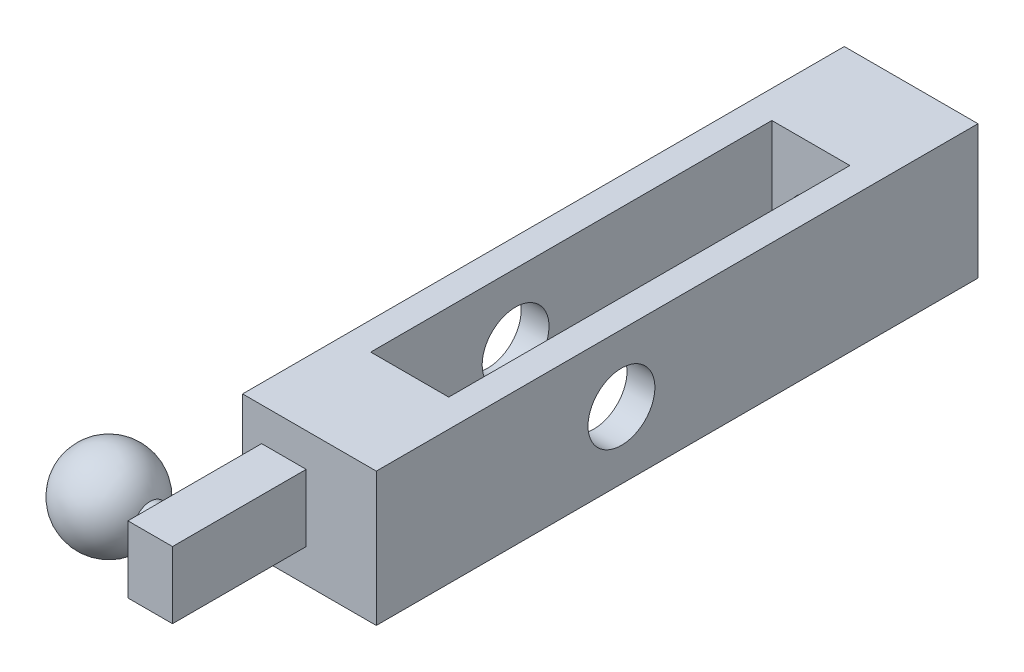
ISO-10303-21;
HEADER;
FILE_DESCRIPTION(('STEP AP214'),'2;1');
FILE_NAME('part.step','',(''),(''),'','','');
FILE_SCHEMA(('AUTOMOTIVE_DESIGN { 1 0 10303 214 1 1 1 1 }'));
ENDSEC;
DATA;
#1=APPLICATION_CONTEXT('core data for automotive mechanical design processes');
#2=APPLICATION_PROTOCOL_DEFINITION('international standard','automotive_design',2000,#1);
#3=PRODUCT_CONTEXT('',#1,'mechanical');
#4=PRODUCT('Part','Part','',(#3));
#5=PRODUCT_RELATED_PRODUCT_CATEGORY('part','',(#4));
#6=PRODUCT_DEFINITION_FORMATION('','',#4);
#7=PRODUCT_DEFINITION_CONTEXT('part definition',#1,'design');
#8=PRODUCT_DEFINITION('design','',#6,#7);
#9=PRODUCT_DEFINITION_SHAPE('','',#8);
#10=(LENGTH_UNIT() NAMED_UNIT(*) SI_UNIT(.MILLI.,.METRE.));
#11=(NAMED_UNIT(*) PLANE_ANGLE_UNIT() SI_UNIT($,.RADIAN.));
#12=(NAMED_UNIT(*) SI_UNIT($,.STERADIAN.) SOLID_ANGLE_UNIT());
#13=UNCERTAINTY_MEASURE_WITH_UNIT(LENGTH_MEASURE(1.E-05),#10,'distance_accuracy_value','');
#14=(GEOMETRIC_REPRESENTATION_CONTEXT(3) GLOBAL_UNCERTAINTY_ASSIGNED_CONTEXT((#13)) GLOBAL_UNIT_ASSIGNED_CONTEXT((#10,
#11,#12)) REPRESENTATION_CONTEXT('',''));
#15=CARTESIAN_POINT('',(0.,0.,0.));
#16=DIRECTION('',(0.,0.,1.));
#17=DIRECTION('',(1.,0.,0.));
#18=AXIS2_PLACEMENT_3D('',#15,#16,#17);
#19=CARTESIAN_POINT('',(3.,-3.,27.));
#20=DIRECTION('',(0.,1.,0.));
#21=DIRECTION('',(-1.,0.,0.));
#22=AXIS2_PLACEMENT_3D('',#19,#20,#21);
#23=PLANE('',#22);
#24=DIRECTION('',(1.,0.,0.));
#25=VECTOR('',#24,1.);
#26=CARTESIAN_POINT('',(3.,-3.,0.));
#27=LINE('',#26,#25);
#28=CARTESIAN_POINT('',(-3.,-3.,0.));
#29=VERTEX_POINT('',#28);
#30=CARTESIAN_POINT('',(3.,-3.,0.));
#31=VERTEX_POINT('',#30);
#32=EDGE_CURVE('E218',#29,#31,#27,.T.);
#33=ORIENTED_EDGE('',*,*,#32,.T.);
#34=DIRECTION('',(0.,0.,-1.));
#35=VECTOR('',#34,1.);
#36=CARTESIAN_POINT('',(3.,-3.,27.));
#37=LINE('',#36,#35);
#38=CARTESIAN_POINT('',(3.,-3.,27.));
#39=VERTEX_POINT('',#38);
#40=EDGE_CURVE('E228',#39,#31,#37,.T.);
#41=ORIENTED_EDGE('',*,*,#40,.F.);
#42=DIRECTION('',(1.,0.,0.));
#43=VECTOR('',#42,1.);
#44=CARTESIAN_POINT('',(3.,-3.,27.));
#45=LINE('',#44,#43);
#46=CARTESIAN_POINT('',(-3.,-3.,27.));
#47=VERTEX_POINT('',#46);
#48=EDGE_CURVE('E208',#47,#39,#45,.T.);
#49=ORIENTED_EDGE('',*,*,#48,.F.);
#50=DIRECTION('',(0.,0.,-1.));
#51=VECTOR('',#50,1.);
#52=CARTESIAN_POINT('',(-3.,-3.,27.));
#53=LINE('',#52,#51);
#54=EDGE_CURVE('E50',#47,#29,#53,.T.);
#55=ORIENTED_EDGE('',*,*,#54,.T.);
#56=EDGE_LOOP('',(#33,#41,#49,#55));
#57=FACE_BOUND('',#56,.T.);
#58=DIRECTION('',(1.,0.,0.));
#59=VECTOR('',#58,1.);
#60=CARTESIAN_POINT('',(3.,-3.,4.5));
#61=LINE('',#60,#59);
#62=CARTESIAN_POINT('',(-1.75,-3.,4.5));
#63=VERTEX_POINT('',#62);
#64=CARTESIAN_POINT('',(1.75,-3.,4.5));
#65=VERTEX_POINT('',#64);
#66=EDGE_CURVE('E135',#63,#65,#61,.T.);
#67=ORIENTED_EDGE('',*,*,#66,.F.);
#68=DIRECTION('',(0.,0.,-1.));
#69=VECTOR('',#68,1.);
#70=CARTESIAN_POINT('',(-1.75,-3.,27.));
#71=LINE('',#70,#69);
#72=CARTESIAN_POINT('',(-1.75,-3.,22.5));
#73=VERTEX_POINT('',#72);
#74=EDGE_CURVE('E138',#73,#63,#71,.T.);
#75=ORIENTED_EDGE('',*,*,#74,.F.);
#76=DIRECTION('',(-1.,0.,0.));
#77=VECTOR('',#76,1.);
#78=CARTESIAN_POINT('',(3.,-3.,22.5));
#79=LINE('',#78,#77);
#80=CARTESIAN_POINT('',(1.75,-3.,22.5));
#81=VERTEX_POINT('',#80);
#82=EDGE_CURVE('E167',#81,#73,#79,.T.);
#83=ORIENTED_EDGE('',*,*,#82,.F.);
#84=DIRECTION('',(0.,0.,1.));
#85=VECTOR('',#84,1.);
#86=CARTESIAN_POINT('',(1.75,-3.,27.));
#87=LINE('',#86,#85);
#88=EDGE_CURVE('E169',#65,#81,#87,.T.);
#89=ORIENTED_EDGE('',*,*,#88,.F.);
#90=EDGE_LOOP('',(#67,#75,#83,#89));
#91=FACE_BOUND('',#90,.T.);
#92=ADVANCED_FACE('F41',(#57,#91),#23,.F.);
#93=CARTESIAN_POINT('',(3.,3.,27.));
#94=DIRECTION('',(0.,-1.,0.));
#95=DIRECTION('',(1.,0.,0.));
#96=AXIS2_PLACEMENT_3D('',#93,#94,#95);
#97=PLANE('',#96);
#98=DIRECTION('',(-1.,0.,0.));
#99=VECTOR('',#98,1.);
#100=CARTESIAN_POINT('',(3.,3.,0.));
#101=LINE('',#100,#99);
#102=CARTESIAN_POINT('',(3.,3.,0.));
#103=VERTEX_POINT('',#102);
#104=CARTESIAN_POINT('',(-3.,3.,0.));
#105=VERTEX_POINT('',#104);
#106=EDGE_CURVE('E209',#103,#105,#101,.T.);
#107=ORIENTED_EDGE('',*,*,#106,.T.);
#108=DIRECTION('',(0.,0.,-1.));
#109=VECTOR('',#108,1.);
#110=CARTESIAN_POINT('',(-3.,3.,27.));
#111=LINE('',#110,#109);
#112=CARTESIAN_POINT('',(-3.,3.,27.));
#113=VERTEX_POINT('',#112);
#114=EDGE_CURVE('E215',#113,#105,#111,.T.);
#115=ORIENTED_EDGE('',*,*,#114,.F.);
#116=DIRECTION('',(-1.,0.,0.));
#117=VECTOR('',#116,1.);
#118=CARTESIAN_POINT('',(3.,3.,27.));
#119=LINE('',#118,#117);
#120=CARTESIAN_POINT('',(3.,3.,27.));
#121=VERTEX_POINT('',#120);
#122=EDGE_CURVE('E213',#121,#113,#119,.T.);
#123=ORIENTED_EDGE('',*,*,#122,.F.);
#124=DIRECTION('',(0.,0.,-1.));
#125=VECTOR('',#124,1.);
#126=CARTESIAN_POINT('',(3.,3.,27.));
#127=LINE('',#126,#125);
#128=EDGE_CURVE('E225',#121,#103,#127,.T.);
#129=ORIENTED_EDGE('',*,*,#128,.T.);
#130=EDGE_LOOP('',(#107,#115,#123,#129));
#131=FACE_BOUND('',#130,.T.);
#132=DIRECTION('',(1.,0.,0.));
#133=VECTOR('',#132,1.);
#134=CARTESIAN_POINT('',(-1.75,3.,4.5));
#135=LINE('',#134,#133);
#136=CARTESIAN_POINT('',(-1.75,3.,4.5));
#137=VERTEX_POINT('',#136);
#138=CARTESIAN_POINT('',(1.75,3.,4.5));
#139=VERTEX_POINT('',#138);
#140=EDGE_CURVE('E66',#137,#139,#135,.T.);
#141=ORIENTED_EDGE('',*,*,#140,.T.);
#142=DIRECTION('',(0.,0.,1.));
#143=VECTOR('',#142,1.);
#144=CARTESIAN_POINT('',(1.75,3.,4.5));
#145=LINE('',#144,#143);
#146=CARTESIAN_POINT('',(1.75,3.,22.5));
#147=VERTEX_POINT('',#146);
#148=EDGE_CURVE('E142',#139,#147,#145,.T.);
#149=ORIENTED_EDGE('',*,*,#148,.T.);
#150=DIRECTION('',(-1.,0.,0.));
#151=VECTOR('',#150,1.);
#152=CARTESIAN_POINT('',(-1.75,3.,22.5));
#153=LINE('',#152,#151);
#154=CARTESIAN_POINT('',(-1.75,3.,22.5));
#155=VERTEX_POINT('',#154);
#156=EDGE_CURVE('E148',#147,#155,#153,.T.);
#157=ORIENTED_EDGE('',*,*,#156,.T.);
#158=DIRECTION('',(0.,0.,-1.));
#159=VECTOR('',#158,1.);
#160=CARTESIAN_POINT('',(-1.75,3.,4.5));
#161=LINE('',#160,#159);
#162=EDGE_CURVE('E152',#155,#137,#161,.T.);
#163=ORIENTED_EDGE('',*,*,#162,.T.);
#164=EDGE_LOOP('',(#141,#149,#157,#163));
#165=FACE_BOUND('',#164,.T.);
#166=ADVANCED_FACE('F151',(#131,#165),#97,.F.);
#167=CARTESIAN_POINT('',(0.,0.,27.));
#168=DIRECTION('',(0.,0.,1.));
#169=DIRECTION('',(1.,0.,0.));
#170=AXIS2_PLACEMENT_3D('',#167,#168,#169);
#171=PLANE('',#170);
#172=DIRECTION('',(0.,-1.,0.));
#173=VECTOR('',#172,1.);
#174=CARTESIAN_POINT('',(-3.,-3.,27.));
#175=LINE('',#174,#173);
#176=EDGE_CURVE('E205',#113,#47,#175,.T.);
#177=ORIENTED_EDGE('',*,*,#176,.T.);
#178=ORIENTED_EDGE('',*,*,#48,.T.);
#179=DIRECTION('',(0.,1.,0.));
#180=VECTOR('',#179,1.);
#181=CARTESIAN_POINT('',(3.,-3.,27.));
#182=LINE('',#181,#180);
#183=EDGE_CURVE('E211',#39,#121,#182,.T.);
#184=ORIENTED_EDGE('',*,*,#183,.T.);
#185=ORIENTED_EDGE('',*,*,#122,.T.);
#186=EDGE_LOOP('',(#177,#178,#184,#185));
#187=FACE_BOUND('',#186,.T.);
#188=DIRECTION('',(-1.,0.,0.));
#189=VECTOR('',#188,1.);
#190=CARTESIAN_POINT('',(-2.14479354998716,1.49545918544692,27.));
#191=LINE('',#190,#189);
#192=CARTESIAN_POINT('',(-0.144793549987163,1.49545918544692,27.));
#193=VERTEX_POINT('',#192);
#194=CARTESIAN_POINT('',(-2.14479354998716,1.49545918544692,27.));
#195=VERTEX_POINT('',#194);
#196=EDGE_CURVE('E189',#193,#195,#191,.T.);
#197=ORIENTED_EDGE('',*,*,#196,.F.);
#198=DIRECTION('',(0.,1.,0.));
#199=VECTOR('',#198,1.);
#200=CARTESIAN_POINT('',(-0.144793549987163,1.49545918544692,27.));
#201=LINE('',#200,#199);
#202=CARTESIAN_POINT('',(-0.144793549987163,-1.50454081455308,27.));
#203=VERTEX_POINT('',#202);
#204=EDGE_CURVE('E175',#203,#193,#201,.T.);
#205=ORIENTED_EDGE('',*,*,#204,.F.);
#206=DIRECTION('',(1.,0.,0.));
#207=VECTOR('',#206,1.);
#208=CARTESIAN_POINT('',(-2.14479354998716,-1.50454081455308,27.));
#209=LINE('',#208,#207);
#210=CARTESIAN_POINT('',(-2.14479354998716,-1.50454081455308,27.));
#211=VERTEX_POINT('',#210);
#212=EDGE_CURVE('E180',#211,#203,#209,.T.);
#213=ORIENTED_EDGE('',*,*,#212,.F.);
#214=DIRECTION('',(0.,-1.,0.));
#215=VECTOR('',#214,1.);
#216=CARTESIAN_POINT('',(-2.14479354998716,1.49545918544692,27.));
#217=LINE('',#216,#215);
#218=EDGE_CURVE('E191',#195,#211,#217,.T.);
#219=ORIENTED_EDGE('',*,*,#218,.F.);
#220=EDGE_LOOP('',(#197,#205,#213,#219));
#221=FACE_BOUND('',#220,.T.);
#222=ADVANCED_FACE('F272',(#187,#221),#171,.T.);
#223=CARTESIAN_POINT('',(-3.,-3.,27.));
#224=DIRECTION('',(1.,0.,0.));
#225=DIRECTION('',(0.,0.,-1.));
#226=AXIS2_PLACEMENT_3D('',#223,#224,#225);
#227=PLANE('',#226);
#228=CARTESIAN_POINT('',(-3.,0.,16.));
#229=DIRECTION('',(-1.,0.,0.));
#230=DIRECTION('',(0.,0.,1.));
#231=AXIS2_PLACEMENT_3D('',#228,#229,#230);
#232=CIRCLE('',#231,1.5);
#233=CARTESIAN_POINT('',(-3.,0.,17.5));
#234=VERTEX_POINT('',#233);
#235=EDGE_CURVE('E234',#234,#234,#232,.T.);
#236=ORIENTED_EDGE('',*,*,#235,.F.);
#237=EDGE_LOOP('',(#236));
#238=FACE_BOUND('',#237,.T.);
#239=DIRECTION('',(0.,-1.,0.));
#240=VECTOR('',#239,1.);
#241=CARTESIAN_POINT('',(-3.,-3.,0.));
#242=LINE('',#241,#240);
#243=EDGE_CURVE('E204',#105,#29,#242,.T.);
#244=ORIENTED_EDGE('',*,*,#243,.T.);
#245=ORIENTED_EDGE('',*,*,#54,.F.);
#246=ORIENTED_EDGE('',*,*,#176,.F.);
#247=ORIENTED_EDGE('',*,*,#114,.T.);
#248=EDGE_LOOP('',(#244,#245,#246,#247));
#249=FACE_BOUND('',#248,.T.);
#250=ADVANCED_FACE('F43',(#238,#249),#227,.F.);
#251=CARTESIAN_POINT('',(3.,-3.,27.));
#252=DIRECTION('',(-1.,0.,0.));
#253=DIRECTION('',(0.,0.,1.));
#254=AXIS2_PLACEMENT_3D('',#251,#252,#253);
#255=PLANE('',#254);
#256=CARTESIAN_POINT('',(3.,0.,16.));
#257=DIRECTION('',(-1.,0.,0.));
#258=DIRECTION('',(0.,0.,1.));
#259=AXIS2_PLACEMENT_3D('',#256,#257,#258);
#260=CIRCLE('',#259,1.5);
#261=CARTESIAN_POINT('',(3.,0.,17.5));
#262=VERTEX_POINT('',#261);
#263=EDGE_CURVE('E153',#262,#262,#260,.T.);
#264=ORIENTED_EDGE('',*,*,#263,.T.);
#265=EDGE_LOOP('',(#264));
#266=FACE_BOUND('',#265,.T.);
#267=DIRECTION('',(0.,1.,0.));
#268=VECTOR('',#267,1.);
#269=CARTESIAN_POINT('',(3.,-3.,0.));
#270=LINE('',#269,#268);
#271=EDGE_CURVE('E220',#31,#103,#270,.T.);
#272=ORIENTED_EDGE('',*,*,#271,.T.);
#273=ORIENTED_EDGE('',*,*,#128,.F.);
#274=ORIENTED_EDGE('',*,*,#183,.F.);
#275=ORIENTED_EDGE('',*,*,#40,.T.);
#276=EDGE_LOOP('',(#272,#273,#274,#275));
#277=FACE_BOUND('',#276,.T.);
#278=ADVANCED_FACE('F254',(#266,#277),#255,.F.);
#279=CARTESIAN_POINT('',(0.,0.,0.));
#280=DIRECTION('',(0.,0.,1.));
#281=DIRECTION('',(1.,0.,0.));
#282=AXIS2_PLACEMENT_3D('',#279,#280,#281);
#283=PLANE('',#282);
#284=CARTESIAN_POINT('',(0.,0.,0.));
#285=DIRECTION('',(0.,0.,-1.));
#286=DIRECTION('',(-1.,0.,0.));
#287=AXIS2_PLACEMENT_3D('',#284,#285,#286);
#288=CIRCLE('',#287,0.9);
#289=CARTESIAN_POINT('',(-0.9,0.,0.));
#290=VERTEX_POINT('',#289);
#291=EDGE_CURVE('E243',#290,#290,#288,.T.);
#292=ORIENTED_EDGE('',*,*,#291,.F.);
#293=EDGE_LOOP('',(#292));
#294=FACE_BOUND('',#293,.T.);
#295=ORIENTED_EDGE('',*,*,#243,.F.);
#296=ORIENTED_EDGE('',*,*,#106,.F.);
#297=ORIENTED_EDGE('',*,*,#271,.F.);
#298=ORIENTED_EDGE('',*,*,#32,.F.);
#299=EDGE_LOOP('',(#295,#296,#297,#298));
#300=FACE_BOUND('',#299,.T.);
#301=ADVANCED_FACE('F250',(#294,#300),#283,.F.);
#302=CARTESIAN_POINT('',(-0.144793549987163,1.49545918544692,33.));
#303=DIRECTION('',(-1.,0.,0.));
#304=DIRECTION('',(0.,-1.,0.));
#305=AXIS2_PLACEMENT_3D('',#302,#303,#304);
#306=PLANE('',#305);
#307=ORIENTED_EDGE('',*,*,#204,.T.);
#308=DIRECTION('',(0.,0.,-1.));
#309=VECTOR('',#308,1.);
#310=CARTESIAN_POINT('',(-0.144793549987163,1.49545918544692,33.));
#311=LINE('',#310,#309);
#312=CARTESIAN_POINT('',(-0.144793549987163,1.49545918544692,33.));
#313=VERTEX_POINT('',#312);
#314=EDGE_CURVE('E202',#313,#193,#311,.T.);
#315=ORIENTED_EDGE('',*,*,#314,.F.);
#316=DIRECTION('',(0.,1.,0.));
#317=VECTOR('',#316,1.);
#318=CARTESIAN_POINT('',(-0.144793549987163,1.49545918544692,33.));
#319=LINE('',#318,#317);
#320=CARTESIAN_POINT('',(-0.144793549987163,-1.50454081455308,33.));
#321=VERTEX_POINT('',#320);
#322=EDGE_CURVE('E176',#321,#313,#319,.T.);
#323=ORIENTED_EDGE('',*,*,#322,.F.);
#324=DIRECTION('',(0.,0.,-1.));
#325=VECTOR('',#324,1.);
#326=CARTESIAN_POINT('',(-0.144793549987163,-1.50454081455308,33.));
#327=LINE('',#326,#325);
#328=EDGE_CURVE('E186',#321,#203,#327,.T.);
#329=ORIENTED_EDGE('',*,*,#328,.T.);
#330=EDGE_LOOP('',(#307,#315,#323,#329));
#331=FACE_BOUND('',#330,.T.);
#332=ADVANCED_FACE('F253',(#331),#306,.F.);
#333=CARTESIAN_POINT('',(-2.14479354998716,1.49545918544692,33.));
#334=DIRECTION('',(0.,-1.,0.));
#335=DIRECTION('',(1.,0.,0.));
#336=AXIS2_PLACEMENT_3D('',#333,#334,#335);
#337=PLANE('',#336);
#338=ORIENTED_EDGE('',*,*,#196,.T.);
#339=DIRECTION('',(0.,0.,-1.));
#340=VECTOR('',#339,1.);
#341=CARTESIAN_POINT('',(-2.14479354998716,1.49545918544692,33.));
#342=LINE('',#341,#340);
#343=CARTESIAN_POINT('',(-2.14479354998716,1.49545918544692,33.));
#344=VERTEX_POINT('',#343);
#345=EDGE_CURVE('E199',#344,#195,#342,.T.);
#346=ORIENTED_EDGE('',*,*,#345,.F.);
#347=DIRECTION('',(-1.,0.,0.));
#348=VECTOR('',#347,1.);
#349=CARTESIAN_POINT('',(-2.14479354998716,1.49545918544692,33.));
#350=LINE('',#349,#348);
#351=EDGE_CURVE('E179',#313,#344,#350,.T.);
#352=ORIENTED_EDGE('',*,*,#351,.F.);
#353=ORIENTED_EDGE('',*,*,#314,.T.);
#354=EDGE_LOOP('',(#338,#346,#352,#353));
#355=FACE_BOUND('',#354,.T.);
#356=ADVANCED_FACE('F282',(#355),#337,.F.);
#357=CARTESIAN_POINT('',(-2.14479354998716,1.49545918544692,33.));
#358=DIRECTION('',(1.,0.,0.));
#359=DIRECTION('',(0.,1.,0.));
#360=AXIS2_PLACEMENT_3D('',#357,#358,#359);
#361=PLANE('',#360);
#362=CARTESIAN_POINT('',(-2.14479354998716,0.,31.));
#363=DIRECTION('',(1.,0.,0.));
#364=DIRECTION('',(0.,1.,0.));
#365=AXIS2_PLACEMENT_3D('',#362,#363,#364);
#366=CIRCLE('',#365,0.749999999999999);
#367=CARTESIAN_POINT('',(-2.14479354998716,0.749999999999998,31.));
#368=VERTEX_POINT('',#367);
#369=EDGE_CURVE('E11',#368,#368,#366,.F.);
#370=ORIENTED_EDGE('',*,*,#369,.F.);
#371=EDGE_LOOP('',(#370));
#372=FACE_BOUND('',#371,.T.);
#373=ORIENTED_EDGE('',*,*,#218,.T.);
#374=DIRECTION('',(0.,0.,-1.));
#375=VECTOR('',#374,1.);
#376=CARTESIAN_POINT('',(-2.14479354998716,-1.50454081455308,33.));
#377=LINE('',#376,#375);
#378=CARTESIAN_POINT('',(-2.14479354998716,-1.50454081455308,33.));
#379=VERTEX_POINT('',#378);
#380=EDGE_CURVE('E197',#379,#211,#377,.T.);
#381=ORIENTED_EDGE('',*,*,#380,.F.);
#382=DIRECTION('',(0.,-1.,0.));
#383=VECTOR('',#382,1.);
#384=CARTESIAN_POINT('',(-2.14479354998716,1.49545918544692,33.));
#385=LINE('',#384,#383);
#386=EDGE_CURVE('E182',#344,#379,#385,.T.);
#387=ORIENTED_EDGE('',*,*,#386,.F.);
#388=ORIENTED_EDGE('',*,*,#345,.T.);
#389=EDGE_LOOP('',(#373,#381,#387,#388));
#390=FACE_BOUND('',#389,.T.);
#391=ADVANCED_FACE('F286',(#372,#390),#361,.F.);
#392=CARTESIAN_POINT('',(-2.14479354998716,-1.50454081455308,33.));
#393=DIRECTION('',(0.,1.,0.));
#394=DIRECTION('',(-1.,0.,0.));
#395=AXIS2_PLACEMENT_3D('',#392,#393,#394);
#396=PLANE('',#395);
#397=ORIENTED_EDGE('',*,*,#212,.T.);
#398=ORIENTED_EDGE('',*,*,#328,.F.);
#399=DIRECTION('',(1.,0.,0.));
#400=VECTOR('',#399,1.);
#401=CARTESIAN_POINT('',(-2.14479354998716,-1.50454081455308,33.));
#402=LINE('',#401,#400);
#403=EDGE_CURVE('E184',#379,#321,#402,.T.);
#404=ORIENTED_EDGE('',*,*,#403,.F.);
#405=ORIENTED_EDGE('',*,*,#380,.T.);
#406=EDGE_LOOP('',(#397,#398,#404,#405));
#407=FACE_BOUND('',#406,.T.);
#408=ADVANCED_FACE('F295',(#407),#396,.F.);
#409=CARTESIAN_POINT('',(0.,0.,33.));
#410=DIRECTION('',(0.,0.,1.));
#411=DIRECTION('',(1.,0.,0.));
#412=AXIS2_PLACEMENT_3D('',#409,#410,#411);
#413=PLANE('',#412);
#414=ORIENTED_EDGE('',*,*,#322,.T.);
#415=ORIENTED_EDGE('',*,*,#351,.T.);
#416=ORIENTED_EDGE('',*,*,#386,.T.);
#417=ORIENTED_EDGE('',*,*,#403,.T.);
#418=EDGE_LOOP('',(#414,#415,#416,#417));
#419=FACE_BOUND('',#418,.T.);
#420=ADVANCED_FACE('F290',(#419),#413,.T.);
#421=CARTESIAN_POINT('',(-3.14479354998716,0.,31.));
#422=DIRECTION('',(1.,0.,0.));
#423=DIRECTION('',(0.,1.,0.));
#424=AXIS2_PLACEMENT_3D('',#421,#422,#423);
#425=CYLINDRICAL_SURFACE('',#424,0.749999999999999);
#426=CARTESIAN_POINT('',(-3.14479354998716,0.,31.));
#427=DIRECTION('',(-1.,0.,0.));
#428=DIRECTION('',(0.,-1.,0.));
#429=AXIS2_PLACEMENT_3D('',#426,#427,#428);
#430=CIRCLE('',#429,0.749999999999999);
#431=CARTESIAN_POINT('',(-3.14479354998716,-0.749999999999999,31.));
#432=VERTEX_POINT('',#431);
#433=EDGE_CURVE('E172',#432,#432,#430,.T.);
#434=ORIENTED_EDGE('',*,*,#433,.F.);
#435=EDGE_LOOP('',(#434));
#436=FACE_BOUND('',#435,.T.);
#437=ORIENTED_EDGE('',*,*,#369,.T.);
#438=EDGE_LOOP('',(#437));
#439=FACE_BOUND('',#438,.T.);
#440=ADVANCED_FACE('F302',(#436,#439),#425,.T.);
#441=CARTESIAN_POINT('',(-4.99884317176108,0.,31.));
#442=DIRECTION('',(1.,0.,0.));
#443=DIRECTION('',(0.,0.,-1.));
#444=AXIS2_PLACEMENT_3D('',#441,#442,#443);
#445=SPHERICAL_SURFACE('',#444,2.);
#446=ORIENTED_EDGE('',*,*,#433,.T.);
#447=EDGE_LOOP('',(#446));
#448=FACE_BOUND('',#447,.T.);
#449=ADVANCED_FACE('F360',(#448),#445,.T.);
#450=CARTESIAN_POINT('',(-1.75,-5.,4.5));
#451=DIRECTION('',(0.,0.,1.));
#452=DIRECTION('',(1.,0.,0.));
#453=AXIS2_PLACEMENT_3D('',#450,#451,#452);
#454=PLANE('',#453);
#455=CARTESIAN_POINT('',(0.,0.,4.5));
#456=DIRECTION('',(0.,0.,1.));
#457=DIRECTION('',(1.,0.,0.));
#458=AXIS2_PLACEMENT_3D('',#455,#456,#457);
#459=CIRCLE('',#458,0.9);
#460=CARTESIAN_POINT('',(0.9,0.,4.5));
#461=VERTEX_POINT('',#460);
#462=EDGE_CURVE('E45',#461,#461,#459,.T.);
#463=ORIENTED_EDGE('',*,*,#462,.F.);
#464=EDGE_LOOP('',(#463));
#465=FACE_BOUND('',#464,.T.);
#466=ORIENTED_EDGE('',*,*,#66,.T.);
#467=DIRECTION('',(0.,1.,0.));
#468=VECTOR('',#467,1.);
#469=CARTESIAN_POINT('',(1.75,-5.,4.5));
#470=LINE('',#469,#468);
#471=EDGE_CURVE('E131',#65,#139,#470,.T.);
#472=ORIENTED_EDGE('',*,*,#471,.T.);
#473=ORIENTED_EDGE('',*,*,#140,.F.);
#474=DIRECTION('',(0.,1.,0.));
#475=VECTOR('',#474,1.);
#476=CARTESIAN_POINT('',(-1.75,-5.,4.5));
#477=LINE('',#476,#475);
#478=EDGE_CURVE('E162',#63,#137,#477,.T.);
#479=ORIENTED_EDGE('',*,*,#478,.F.);
#480=EDGE_LOOP('',(#466,#472,#473,#479));
#481=FACE_BOUND('',#480,.T.);
#482=ADVANCED_FACE('F133',(#465,#481),#454,.T.);
#483=CARTESIAN_POINT('',(1.75,-5.,4.5));
#484=DIRECTION('',(-1.,0.,0.));
#485=DIRECTION('',(0.,-1.,0.));
#486=AXIS2_PLACEMENT_3D('',#483,#484,#485);
#487=PLANE('',#486);
#488=CARTESIAN_POINT('',(1.75,0.,16.));
#489=DIRECTION('',(-1.,0.,0.));
#490=DIRECTION('',(0.,-1.,0.));
#491=AXIS2_PLACEMENT_3D('',#488,#489,#490);
#492=CIRCLE('',#491,1.5);
#493=CARTESIAN_POINT('',(1.75,-1.5,16.));
#494=VERTEX_POINT('',#493);
#495=EDGE_CURVE('E156',#494,#494,#492,.T.);
#496=ORIENTED_EDGE('',*,*,#495,.F.);
#497=EDGE_LOOP('',(#496));
#498=FACE_BOUND('',#497,.T.);
#499=ORIENTED_EDGE('',*,*,#88,.T.);
#500=DIRECTION('',(0.,1.,0.));
#501=VECTOR('',#500,1.);
#502=CARTESIAN_POINT('',(1.75,-5.,22.5));
#503=LINE('',#502,#501);
#504=EDGE_CURVE('E139',#81,#147,#503,.T.);
#505=ORIENTED_EDGE('',*,*,#504,.T.);
#506=ORIENTED_EDGE('',*,*,#148,.F.);
#507=ORIENTED_EDGE('',*,*,#471,.F.);
#508=EDGE_LOOP('',(#499,#505,#506,#507));
#509=FACE_BOUND('',#508,.T.);
#510=ADVANCED_FACE('F143',(#498,#509),#487,.T.);
#511=CARTESIAN_POINT('',(-1.75000000000001,-5.,22.5));
#512=DIRECTION('',(0.,0.,-1.));
#513=DIRECTION('',(-1.,0.,0.));
#514=AXIS2_PLACEMENT_3D('',#511,#512,#513);
#515=PLANE('',#514);
#516=ORIENTED_EDGE('',*,*,#82,.T.);
#517=DIRECTION('',(0.,1.,0.));
#518=VECTOR('',#517,1.);
#519=CARTESIAN_POINT('',(-1.75000000000001,-5.,22.5));
#520=LINE('',#519,#518);
#521=EDGE_CURVE('E58',#73,#155,#520,.T.);
#522=ORIENTED_EDGE('',*,*,#521,.T.);
#523=ORIENTED_EDGE('',*,*,#156,.F.);
#524=ORIENTED_EDGE('',*,*,#504,.F.);
#525=EDGE_LOOP('',(#516,#522,#523,#524));
#526=FACE_BOUND('',#525,.T.);
#527=ADVANCED_FACE('F395',(#526),#515,.T.);
#528=CARTESIAN_POINT('',(-1.75,-5.,4.5));
#529=DIRECTION('',(1.,0.,0.));
#530=DIRECTION('',(0.,1.,0.));
#531=AXIS2_PLACEMENT_3D('',#528,#529,#530);
#532=PLANE('',#531);
#533=CARTESIAN_POINT('',(-1.75,0.,16.));
#534=DIRECTION('',(1.,0.,0.));
#535=DIRECTION('',(0.,1.,0.));
#536=AXIS2_PLACEMENT_3D('',#533,#534,#535);
#537=CIRCLE('',#536,1.5);
#538=CARTESIAN_POINT('',(-1.75,1.5,16.));
#539=VERTEX_POINT('',#538);
#540=EDGE_CURVE('E232',#539,#539,#537,.T.);
#541=ORIENTED_EDGE('',*,*,#540,.F.);
#542=EDGE_LOOP('',(#541));
#543=FACE_BOUND('',#542,.T.);
#544=ORIENTED_EDGE('',*,*,#74,.T.);
#545=ORIENTED_EDGE('',*,*,#478,.T.);
#546=ORIENTED_EDGE('',*,*,#162,.F.);
#547=ORIENTED_EDGE('',*,*,#521,.F.);
#548=EDGE_LOOP('',(#544,#545,#546,#547));
#549=FACE_BOUND('',#548,.T.);
#550=ADVANCED_FACE('F403',(#543,#549),#532,.T.);
#551=CARTESIAN_POINT('',(5.,0.,16.));
#552=DIRECTION('',(-1.,0.,0.));
#553=DIRECTION('',(0.,0.,1.));
#554=AXIS2_PLACEMENT_3D('',#551,#552,#553);
#555=CYLINDRICAL_SURFACE('',#554,1.5);
#556=ORIENTED_EDGE('',*,*,#540,.T.);
#557=EDGE_LOOP('',(#556));
#558=FACE_BOUND('',#557,.T.);
#559=ORIENTED_EDGE('',*,*,#235,.T.);
#560=EDGE_LOOP('',(#559));
#561=FACE_BOUND('',#560,.T.);
#562=ADVANCED_FACE('F412',(#558,#561),#555,.F.);
#563=ORIENTED_EDGE('',*,*,#495,.T.);
#564=EDGE_LOOP('',(#563));
#565=FACE_BOUND('',#564,.T.);
#566=ORIENTED_EDGE('',*,*,#263,.F.);
#567=EDGE_LOOP('',(#566));
#568=FACE_BOUND('',#567,.T.);
#569=ADVANCED_FACE('F421',(#565,#568),#555,.F.);
#570=CARTESIAN_POINT('',(0.,0.,8.));
#571=DIRECTION('',(0.,0.,-1.));
#572=DIRECTION('',(-1.,0.,0.));
#573=AXIS2_PLACEMENT_3D('',#570,#571,#572);
#574=CYLINDRICAL_SURFACE('',#573,0.9);
#575=ORIENTED_EDGE('',*,*,#462,.T.);
#576=EDGE_LOOP('',(#575));
#577=FACE_BOUND('',#576,.T.);
#578=ORIENTED_EDGE('',*,*,#291,.T.);
#579=EDGE_LOOP('',(#578));
#580=FACE_BOUND('',#579,.T.);
#581=ADVANCED_FACE('F248',(#577,#580),#574,.F.);
#582=CLOSED_SHELL('',(#92,#166,#222,#250,#278,#301,#332,#356,#391,#408,#420,#440,#449,#482,#510,
#527,#550,#562,#569,#581));
#583=MANIFOLD_SOLID_BREP('B2',#582);
#584=ADVANCED_BREP_SHAPE_REPRESENTATION('',(#18,#583),#14);
#585=SHAPE_DEFINITION_REPRESENTATION(#9,#584);
ENDSEC;
END-ISO-10303-21;
